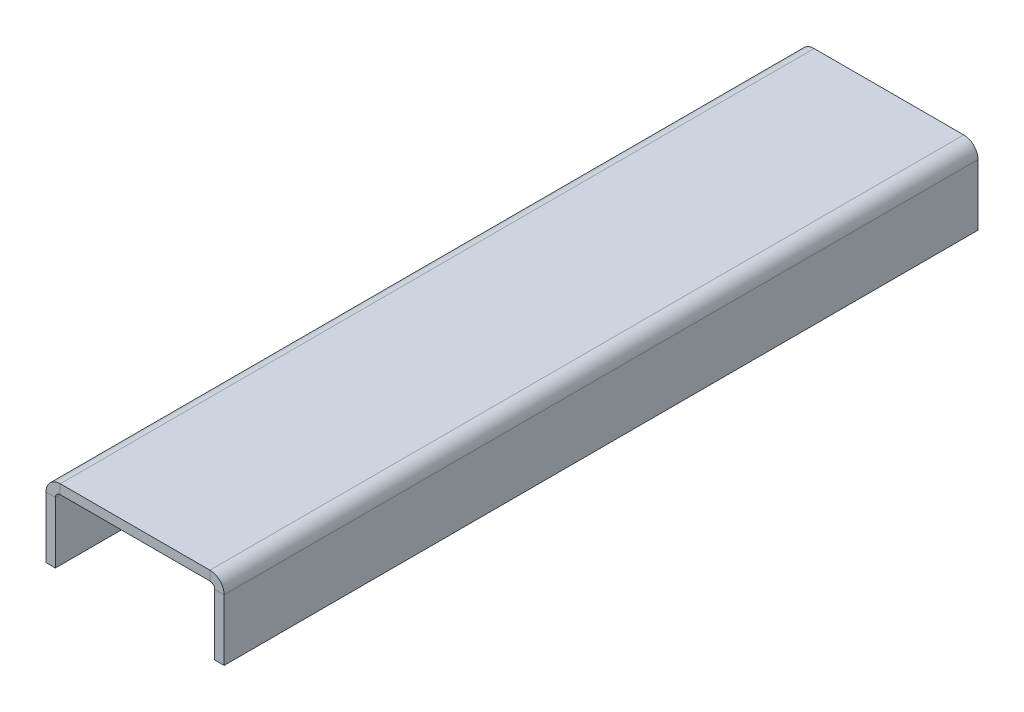
ISO-10303-21;
HEADER;
FILE_DESCRIPTION(('STEP AP214'),'2;1');
FILE_NAME('part.step','',(''),(''),'','','');
FILE_SCHEMA(('AUTOMOTIVE_DESIGN { 1 0 10303 214 1 1 1 1 }'));
ENDSEC;
DATA;
#1=APPLICATION_CONTEXT('core data for automotive mechanical design processes');
#2=APPLICATION_PROTOCOL_DEFINITION('international standard','automotive_design',2000,#1);
#3=PRODUCT_CONTEXT('',#1,'mechanical');
#4=PRODUCT('Part','Part','',(#3));
#5=PRODUCT_RELATED_PRODUCT_CATEGORY('part','',(#4));
#6=PRODUCT_DEFINITION_FORMATION('','',#4);
#7=PRODUCT_DEFINITION_CONTEXT('part definition',#1,'design');
#8=PRODUCT_DEFINITION('design','',#6,#7);
#9=PRODUCT_DEFINITION_SHAPE('','',#8);
#10=(LENGTH_UNIT() NAMED_UNIT(*) SI_UNIT(.MILLI.,.METRE.));
#11=(NAMED_UNIT(*) PLANE_ANGLE_UNIT() SI_UNIT($,.RADIAN.));
#12=(NAMED_UNIT(*) SI_UNIT($,.STERADIAN.) SOLID_ANGLE_UNIT());
#13=UNCERTAINTY_MEASURE_WITH_UNIT(LENGTH_MEASURE(1.E-05),#10,'distance_accuracy_value','');
#14=(GEOMETRIC_REPRESENTATION_CONTEXT(3) GLOBAL_UNCERTAINTY_ASSIGNED_CONTEXT((#13)) GLOBAL_UNIT_ASSIGNED_CONTEXT((#10,
#11,#12)) REPRESENTATION_CONTEXT('',''));
#15=CARTESIAN_POINT('',(0.,0.,0.));
#16=DIRECTION('',(0.,0.,1.));
#17=DIRECTION('',(1.,0.,0.));
#18=AXIS2_PLACEMENT_3D('',#15,#16,#17);
#19=CARTESIAN_POINT('',(-12.60602,0.,127.));
#20=DIRECTION('',(0.,0.,1.));
#21=DIRECTION('',(1.,0.,0.));
#22=AXIS2_PLACEMENT_3D('',#19,#20,#21);
#23=PLANE('',#22);
#24=DIRECTION('',(0.,-1.,0.));
#25=VECTOR('',#24,1.);
#26=CARTESIAN_POINT('',(-12.60602,0.,127.));
#27=LINE('',#26,#25);
#28=CARTESIAN_POINT('',(-12.60602,0.,127.));
#29=VERTEX_POINT('',#28);
#30=CARTESIAN_POINT('',(-12.60602,-1.5875,127.));
#31=VERTEX_POINT('',#30);
#32=EDGE_CURVE('E11',#29,#31,#27,.T.);
#33=ORIENTED_EDGE('',*,*,#32,.F.);
#34=CARTESIAN_POINT('',(-12.60602,-2.4003,127.));
#35=DIRECTION('',(0.,0.,1.));
#36=DIRECTION('',(1.,0.,0.));
#37=AXIS2_PLACEMENT_3D('',#34,#35,#36);
#38=CIRCLE('',#37,2.4003);
#39=CARTESIAN_POINT('',(-15.00632,-2.4003,127.));
#40=VERTEX_POINT('',#39);
#41=EDGE_CURVE('E255',#40,#29,#38,.F.);
#42=ORIENTED_EDGE('',*,*,#41,.F.);
#43=DIRECTION('',(-1.,0.,0.));
#44=VECTOR('',#43,1.);
#45=CARTESIAN_POINT('',(-13.41882,-2.4003,127.));
#46=LINE('',#45,#44);
#47=CARTESIAN_POINT('',(-13.41882,-2.4003,127.));
#48=VERTEX_POINT('',#47);
#49=EDGE_CURVE('E53',#48,#40,#46,.T.);
#50=ORIENTED_EDGE('',*,*,#49,.F.);
#51=CARTESIAN_POINT('',(-12.60602,-2.4003,127.));
#52=DIRECTION('',(0.,0.,1.));
#53=DIRECTION('',(1.,0.,0.));
#54=AXIS2_PLACEMENT_3D('',#51,#52,#53);
#55=CIRCLE('',#54,0.8128);
#56=EDGE_CURVE('E154',#48,#31,#55,.F.);
#57=ORIENTED_EDGE('',*,*,#56,.T.);
#58=EDGE_LOOP('',(#33,#42,#50,#57));
#59=FACE_BOUND('',#58,.T.);
#60=ADVANCED_FACE('F45',(#59),#23,.T.);
#61=CARTESIAN_POINT('',(-13.41882,-2.4003,127.));
#62=DIRECTION('',(0.,0.,1.));
#63=DIRECTION('',(1.,0.,0.));
#64=AXIS2_PLACEMENT_3D('',#61,#62,#63);
#65=PLANE('',#64);
#66=DIRECTION('',(1.,0.,0.));
#67=VECTOR('',#66,1.);
#68=CARTESIAN_POINT('',(-15.00632,0.,127.));
#69=LINE('',#68,#67);
#70=CARTESIAN_POINT('',(12.60602,0.,127.));
#71=VERTEX_POINT('',#70);
#72=EDGE_CURVE('E148',#29,#71,#69,.T.);
#73=ORIENTED_EDGE('',*,*,#72,.F.);
#74=ORIENTED_EDGE('',*,*,#32,.T.);
#75=DIRECTION('',(1.,0.,0.));
#76=VECTOR('',#75,1.);
#77=CARTESIAN_POINT('',(-15.00632,-1.5875,127.));
#78=LINE('',#77,#76);
#79=CARTESIAN_POINT('',(12.60602,-1.5875,127.));
#80=VERTEX_POINT('',#79);
#81=EDGE_CURVE('E145',#31,#80,#78,.T.);
#82=ORIENTED_EDGE('',*,*,#81,.T.);
#83=DIRECTION('',(0.,1.,0.));
#84=VECTOR('',#83,1.);
#85=CARTESIAN_POINT('',(12.60602,-1.5875,127.));
#86=LINE('',#85,#84);
#87=EDGE_CURVE('E236',#80,#71,#86,.T.);
#88=ORIENTED_EDGE('',*,*,#87,.T.);
#89=EDGE_LOOP('',(#73,#74,#82,#88));
#90=FACE_BOUND('',#89,.T.);
#91=ADVANCED_FACE('F143',(#90),#65,.T.);
#92=CARTESIAN_POINT('',(-15.00632,-2.4003,0.));
#93=DIRECTION('',(0.,0.,-1.));
#94=DIRECTION('',(-1.,0.,0.));
#95=AXIS2_PLACEMENT_3D('',#92,#93,#94);
#96=PLANE('',#95);
#97=DIRECTION('',(1.,0.,0.));
#98=VECTOR('',#97,1.);
#99=CARTESIAN_POINT('',(-15.00632,-2.4003,0.));
#100=LINE('',#99,#98);
#101=CARTESIAN_POINT('',(-15.00632,-2.4003,0.));
#102=VERTEX_POINT('',#101);
#103=CARTESIAN_POINT('',(-13.41882,-2.4003,0.));
#104=VERTEX_POINT('',#103);
#105=EDGE_CURVE('E241',#102,#104,#100,.T.);
#106=ORIENTED_EDGE('',*,*,#105,.F.);
#107=CARTESIAN_POINT('',(-12.60602,-2.4003,0.));
#108=DIRECTION('',(0.,0.,1.));
#109=DIRECTION('',(1.,0.,0.));
#110=AXIS2_PLACEMENT_3D('',#107,#108,#109);
#111=CIRCLE('',#110,2.4003);
#112=CARTESIAN_POINT('',(-12.60602,0.,0.));
#113=VERTEX_POINT('',#112);
#114=EDGE_CURVE('E193',#102,#113,#111,.F.);
#115=ORIENTED_EDGE('',*,*,#114,.T.);
#116=DIRECTION('',(0.,1.,0.));
#117=VECTOR('',#116,1.);
#118=CARTESIAN_POINT('',(-12.60602,-1.5875,0.));
#119=LINE('',#118,#117);
#120=CARTESIAN_POINT('',(-12.60602,-1.5875,0.));
#121=VERTEX_POINT('',#120);
#122=EDGE_CURVE('E239',#121,#113,#119,.T.);
#123=ORIENTED_EDGE('',*,*,#122,.F.);
#124=CARTESIAN_POINT('',(-12.60602,-2.4003,0.));
#125=DIRECTION('',(0.,0.,1.));
#126=DIRECTION('',(1.,0.,0.));
#127=AXIS2_PLACEMENT_3D('',#124,#125,#126);
#128=CIRCLE('',#127,0.8128);
#129=EDGE_CURVE('E166',#104,#121,#128,.F.);
#130=ORIENTED_EDGE('',*,*,#129,.F.);
#131=EDGE_LOOP('',(#106,#115,#123,#130));
#132=FACE_BOUND('',#131,.T.);
#133=ADVANCED_FACE('F293',(#132),#96,.T.);
#134=CARTESIAN_POINT('',(-12.60602,-1.5875,0.));
#135=DIRECTION('',(0.,0.,-1.));
#136=DIRECTION('',(-1.,0.,0.));
#137=AXIS2_PLACEMENT_3D('',#134,#135,#136);
#138=PLANE('',#137);
#139=DIRECTION('',(0.,1.,0.));
#140=VECTOR('',#139,1.);
#141=CARTESIAN_POINT('',(-15.00632,-12.7,0.));
#142=LINE('',#141,#140);
#143=CARTESIAN_POINT('',(-15.00632,-12.7,0.));
#144=VERTEX_POINT('',#143);
#145=EDGE_CURVE('E196',#144,#102,#142,.T.);
#146=ORIENTED_EDGE('',*,*,#145,.T.);
#147=ORIENTED_EDGE('',*,*,#105,.T.);
#148=DIRECTION('',(0.,1.,0.));
#149=VECTOR('',#148,1.);
#150=CARTESIAN_POINT('',(-13.41882,-12.7,0.));
#151=LINE('',#150,#149);
#152=CARTESIAN_POINT('',(-13.41882,-12.7,0.));
#153=VERTEX_POINT('',#152);
#154=EDGE_CURVE('E202',#153,#104,#151,.T.);
#155=ORIENTED_EDGE('',*,*,#154,.F.);
#156=DIRECTION('',(-1.,0.,0.));
#157=VECTOR('',#156,1.);
#158=CARTESIAN_POINT('',(-13.41882,-12.7,0.));
#159=LINE('',#158,#157);
#160=EDGE_CURVE('E199',#153,#144,#159,.T.);
#161=ORIENTED_EDGE('',*,*,#160,.T.);
#162=EDGE_LOOP('',(#146,#147,#155,#161));
#163=FACE_BOUND('',#162,.T.);
#164=ADVANCED_FACE('F296',(#163),#138,.T.);
#165=CARTESIAN_POINT('',(15.00632,-2.4003,127.));
#166=DIRECTION('',(0.,0.,1.));
#167=DIRECTION('',(1.,0.,0.));
#168=AXIS2_PLACEMENT_3D('',#165,#166,#167);
#169=PLANE('',#168);
#170=DIRECTION('',(-1.,0.,0.));
#171=VECTOR('',#170,1.);
#172=CARTESIAN_POINT('',(15.00632,-2.4003,127.));
#173=LINE('',#172,#171);
#174=CARTESIAN_POINT('',(15.00632,-2.4003,127.));
#175=VERTEX_POINT('',#174);
#176=CARTESIAN_POINT('',(13.41882,-2.4003,127.));
#177=VERTEX_POINT('',#176);
#178=EDGE_CURVE('E61',#175,#177,#173,.T.);
#179=ORIENTED_EDGE('',*,*,#178,.F.);
#180=CARTESIAN_POINT('',(12.60602,-2.4003,127.));
#181=DIRECTION('',(0.,0.,1.));
#182=DIRECTION('',(1.,0.,0.));
#183=AXIS2_PLACEMENT_3D('',#180,#181,#182);
#184=CIRCLE('',#183,2.4003);
#185=EDGE_CURVE('E265',#71,#175,#184,.F.);
#186=ORIENTED_EDGE('',*,*,#185,.F.);
#187=ORIENTED_EDGE('',*,*,#87,.F.);
#188=CARTESIAN_POINT('',(12.60602,-2.4003,127.));
#189=DIRECTION('',(0.,0.,1.));
#190=DIRECTION('',(1.,0.,0.));
#191=AXIS2_PLACEMENT_3D('',#188,#189,#190);
#192=CIRCLE('',#191,0.8128);
#193=EDGE_CURVE('E174',#80,#177,#192,.F.);
#194=ORIENTED_EDGE('',*,*,#193,.T.);
#195=EDGE_LOOP('',(#179,#186,#187,#194));
#196=FACE_BOUND('',#195,.T.);
#197=ADVANCED_FACE('F288',(#196),#169,.T.);
#198=CARTESIAN_POINT('',(12.60602,-1.5875,127.));
#199=DIRECTION('',(0.,0.,1.));
#200=DIRECTION('',(1.,0.,0.));
#201=AXIS2_PLACEMENT_3D('',#198,#199,#200);
#202=PLANE('',#201);
#203=DIRECTION('',(0.,-1.,0.));
#204=VECTOR('',#203,1.);
#205=CARTESIAN_POINT('',(15.00632,0.,127.));
#206=LINE('',#205,#204);
#207=CARTESIAN_POINT('',(15.00632,-12.7,127.));
#208=VERTEX_POINT('',#207);
#209=EDGE_CURVE('E268',#175,#208,#206,.T.);
#210=ORIENTED_EDGE('',*,*,#209,.F.);
#211=ORIENTED_EDGE('',*,*,#178,.T.);
#212=DIRECTION('',(0.,1.,0.));
#213=VECTOR('',#212,1.);
#214=CARTESIAN_POINT('',(13.41882,0.,127.));
#215=LINE('',#214,#213);
#216=CARTESIAN_POINT('',(13.41882,-12.7,127.));
#217=VERTEX_POINT('',#216);
#218=EDGE_CURVE('E115',#177,#217,#215,.F.);
#219=ORIENTED_EDGE('',*,*,#218,.T.);
#220=DIRECTION('',(-1.,0.,0.));
#221=VECTOR('',#220,1.);
#222=CARTESIAN_POINT('',(15.00632,-12.7,127.));
#223=LINE('',#222,#221);
#224=EDGE_CURVE('E271',#208,#217,#223,.T.);
#225=ORIENTED_EDGE('',*,*,#224,.F.);
#226=EDGE_LOOP('',(#210,#211,#219,#225));
#227=FACE_BOUND('',#226,.T.);
#228=ADVANCED_FACE('F277',(#227),#202,.T.);
#229=CARTESIAN_POINT('',(12.60602,0.,0.));
#230=DIRECTION('',(0.,0.,-1.));
#231=DIRECTION('',(-1.,0.,0.));
#232=AXIS2_PLACEMENT_3D('',#229,#230,#231);
#233=PLANE('',#232);
#234=DIRECTION('',(0.,-1.,0.));
#235=VECTOR('',#234,1.);
#236=CARTESIAN_POINT('',(12.60602,0.,0.));
#237=LINE('',#236,#235);
#238=CARTESIAN_POINT('',(12.60602,0.,0.));
#239=VERTEX_POINT('',#238);
#240=CARTESIAN_POINT('',(12.60602,-1.5875,0.));
#241=VERTEX_POINT('',#240);
#242=EDGE_CURVE('E102',#239,#241,#237,.T.);
#243=ORIENTED_EDGE('',*,*,#242,.F.);
#244=CARTESIAN_POINT('',(12.60602,-2.4003,0.));
#245=DIRECTION('',(0.,0.,1.));
#246=DIRECTION('',(1.,0.,0.));
#247=AXIS2_PLACEMENT_3D('',#244,#245,#246);
#248=CIRCLE('',#247,2.4003);
#249=CARTESIAN_POINT('',(15.00632,-2.4003,0.));
#250=VERTEX_POINT('',#249);
#251=EDGE_CURVE('E189',#239,#250,#248,.F.);
#252=ORIENTED_EDGE('',*,*,#251,.T.);
#253=DIRECTION('',(1.,0.,0.));
#254=VECTOR('',#253,1.);
#255=CARTESIAN_POINT('',(13.41882,-2.4003,0.));
#256=LINE('',#255,#254);
#257=CARTESIAN_POINT('',(13.41882,-2.4003,0.));
#258=VERTEX_POINT('',#257);
#259=EDGE_CURVE('E109',#258,#250,#256,.T.);
#260=ORIENTED_EDGE('',*,*,#259,.F.);
#261=CARTESIAN_POINT('',(12.60602,-2.4003,0.));
#262=DIRECTION('',(0.,0.,1.));
#263=DIRECTION('',(1.,0.,0.));
#264=AXIS2_PLACEMENT_3D('',#261,#262,#263);
#265=CIRCLE('',#264,0.8128);
#266=EDGE_CURVE('E208',#241,#258,#265,.F.);
#267=ORIENTED_EDGE('',*,*,#266,.F.);
#268=EDGE_LOOP('',(#243,#252,#260,#267));
#269=FACE_BOUND('',#268,.T.);
#270=ADVANCED_FACE('F325',(#269),#233,.T.);
#271=CARTESIAN_POINT('',(13.41882,-2.4003,0.));
#272=DIRECTION('',(0.,0.,-1.));
#273=DIRECTION('',(-1.,0.,0.));
#274=AXIS2_PLACEMENT_3D('',#271,#272,#273);
#275=PLANE('',#274);
#276=DIRECTION('',(1.,0.,0.));
#277=VECTOR('',#276,1.);
#278=CARTESIAN_POINT('',(-15.00632,0.,0.));
#279=LINE('',#278,#277);
#280=EDGE_CURVE('E191',#113,#239,#279,.T.);
#281=ORIENTED_EDGE('',*,*,#280,.T.);
#282=ORIENTED_EDGE('',*,*,#242,.T.);
#283=DIRECTION('',(1.,0.,0.));
#284=VECTOR('',#283,1.);
#285=CARTESIAN_POINT('',(-15.00632,-1.5875,0.));
#286=LINE('',#285,#284);
#287=EDGE_CURVE('E206',#121,#241,#286,.T.);
#288=ORIENTED_EDGE('',*,*,#287,.F.);
#289=ORIENTED_EDGE('',*,*,#122,.T.);
#290=EDGE_LOOP('',(#281,#282,#288,#289));
#291=FACE_BOUND('',#290,.T.);
#292=ADVANCED_FACE('F328',(#291),#275,.T.);
#293=CARTESIAN_POINT('',(13.41882,0.,127.));
#294=DIRECTION('',(1.,0.,0.));
#295=DIRECTION('',(0.,0.,-1.));
#296=AXIS2_PLACEMENT_3D('',#293,#294,#295);
#297=PLANE('',#296);
#298=DIRECTION('',(0.,1.,0.));
#299=VECTOR('',#298,1.);
#300=CARTESIAN_POINT('',(13.41882,0.,0.));
#301=LINE('',#300,#299);
#302=CARTESIAN_POINT('',(13.41882,-12.7,0.));
#303=VERTEX_POINT('',#302);
#304=EDGE_CURVE('E180',#258,#303,#301,.F.);
#305=ORIENTED_EDGE('',*,*,#304,.T.);
#306=DIRECTION('',(0.,0.,-1.));
#307=VECTOR('',#306,1.);
#308=CARTESIAN_POINT('',(13.41882,-12.7,127.));
#309=LINE('',#308,#307);
#310=EDGE_CURVE('E232',#217,#303,#309,.T.);
#311=ORIENTED_EDGE('',*,*,#310,.F.);
#312=ORIENTED_EDGE('',*,*,#218,.F.);
#313=DIRECTION('',(0.,0.,-1.));
#314=VECTOR('',#313,1.);
#315=CARTESIAN_POINT('',(13.41882,-2.4003,127.));
#316=LINE('',#315,#314);
#317=EDGE_CURVE('E176',#177,#258,#316,.T.);
#318=ORIENTED_EDGE('',*,*,#317,.T.);
#319=EDGE_LOOP('',(#305,#311,#312,#318));
#320=FACE_BOUND('',#319,.T.);
#321=ADVANCED_FACE('F331',(#320),#297,.F.);
#322=CARTESIAN_POINT('',(15.00632,-12.7,127.));
#323=DIRECTION('',(0.,-1.,0.));
#324=DIRECTION('',(0.,0.,-1.));
#325=AXIS2_PLACEMENT_3D('',#322,#323,#324);
#326=PLANE('',#325);
#327=DIRECTION('',(-1.,0.,0.));
#328=VECTOR('',#327,1.);
#329=CARTESIAN_POINT('',(15.00632,-12.7,0.));
#330=LINE('',#329,#328);
#331=CARTESIAN_POINT('',(15.00632,-12.7,0.));
#332=VERTEX_POINT('',#331);
#333=EDGE_CURVE('E183',#332,#303,#330,.T.);
#334=ORIENTED_EDGE('',*,*,#333,.F.);
#335=DIRECTION('',(0.,0.,-1.));
#336=VECTOR('',#335,1.);
#337=CARTESIAN_POINT('',(15.00632,-12.7,127.));
#338=LINE('',#337,#336);
#339=EDGE_CURVE('E230',#208,#332,#338,.T.);
#340=ORIENTED_EDGE('',*,*,#339,.F.);
#341=ORIENTED_EDGE('',*,*,#224,.T.);
#342=ORIENTED_EDGE('',*,*,#310,.T.);
#343=EDGE_LOOP('',(#334,#340,#341,#342));
#344=FACE_BOUND('',#343,.T.);
#345=ADVANCED_FACE('F276',(#344),#326,.T.);
#346=CARTESIAN_POINT('',(15.00632,0.,127.));
#347=DIRECTION('',(1.,0.,0.));
#348=DIRECTION('',(0.,0.,-1.));
#349=AXIS2_PLACEMENT_3D('',#346,#347,#348);
#350=PLANE('',#349);
#351=DIRECTION('',(0.,-1.,0.));
#352=VECTOR('',#351,1.);
#353=CARTESIAN_POINT('',(15.00632,0.,0.));
#354=LINE('',#353,#352);
#355=EDGE_CURVE('E186',#250,#332,#354,.T.);
#356=ORIENTED_EDGE('',*,*,#355,.F.);
#357=DIRECTION('',(0.,0.,-1.));
#358=VECTOR('',#357,1.);
#359=CARTESIAN_POINT('',(15.00632,-2.4003,127.));
#360=LINE('',#359,#358);
#361=EDGE_CURVE('E227',#175,#250,#360,.T.);
#362=ORIENTED_EDGE('',*,*,#361,.F.);
#363=ORIENTED_EDGE('',*,*,#209,.T.);
#364=ORIENTED_EDGE('',*,*,#339,.T.);
#365=EDGE_LOOP('',(#356,#362,#363,#364));
#366=FACE_BOUND('',#365,.T.);
#367=ADVANCED_FACE('F281',(#366),#350,.T.);
#368=CARTESIAN_POINT('',(12.60602,-2.4003,127.));
#369=DIRECTION('',(0.,0.,-1.));
#370=DIRECTION('',(-1.,0.,0.));
#371=AXIS2_PLACEMENT_3D('',#368,#369,#370);
#372=CYLINDRICAL_SURFACE('',#371,2.4003);
#373=ORIENTED_EDGE('',*,*,#251,.F.);
#374=DIRECTION('',(0.,0.,-1.));
#375=VECTOR('',#374,1.);
#376=CARTESIAN_POINT('',(12.60602,0.,127.));
#377=LINE('',#376,#375);
#378=EDGE_CURVE('E224',#71,#239,#377,.T.);
#379=ORIENTED_EDGE('',*,*,#378,.F.);
#380=ORIENTED_EDGE('',*,*,#185,.T.);
#381=ORIENTED_EDGE('',*,*,#361,.T.);
#382=EDGE_LOOP('',(#373,#379,#380,#381));
#383=FACE_BOUND('',#382,.T.);
#384=ADVANCED_FACE('F284',(#383),#372,.T.);
#385=CARTESIAN_POINT('',(-15.00632,0.,127.));
#386=DIRECTION('',(0.,1.,0.));
#387=DIRECTION('',(0.,0.,1.));
#388=AXIS2_PLACEMENT_3D('',#385,#386,#387);
#389=PLANE('',#388);
#390=ORIENTED_EDGE('',*,*,#280,.F.);
#391=DIRECTION('',(0.,0.,-1.));
#392=VECTOR('',#391,1.);
#393=CARTESIAN_POINT('',(-12.60602,0.,127.));
#394=LINE('',#393,#392);
#395=EDGE_CURVE('E221',#29,#113,#394,.T.);
#396=ORIENTED_EDGE('',*,*,#395,.F.);
#397=ORIENTED_EDGE('',*,*,#72,.T.);
#398=ORIENTED_EDGE('',*,*,#378,.T.);
#399=EDGE_LOOP('',(#390,#396,#397,#398));
#400=FACE_BOUND('',#399,.T.);
#401=ADVANCED_FACE('F291',(#400),#389,.T.);
#402=CARTESIAN_POINT('',(-12.60602,-2.4003,127.));
#403=DIRECTION('',(0.,0.,-1.));
#404=DIRECTION('',(-1.,0.,0.));
#405=AXIS2_PLACEMENT_3D('',#402,#403,#404);
#406=CYLINDRICAL_SURFACE('',#405,2.4003);
#407=ORIENTED_EDGE('',*,*,#114,.F.);
#408=DIRECTION('',(0.,0.,-1.));
#409=VECTOR('',#408,1.);
#410=CARTESIAN_POINT('',(-15.00632,-2.4003,127.));
#411=LINE('',#410,#409);
#412=EDGE_CURVE('E218',#40,#102,#411,.T.);
#413=ORIENTED_EDGE('',*,*,#412,.F.);
#414=ORIENTED_EDGE('',*,*,#41,.T.);
#415=ORIENTED_EDGE('',*,*,#395,.T.);
#416=EDGE_LOOP('',(#407,#413,#414,#415));
#417=FACE_BOUND('',#416,.T.);
#418=ADVANCED_FACE('F254',(#417),#406,.T.);
#419=CARTESIAN_POINT('',(-15.00632,-12.7,127.));
#420=DIRECTION('',(-1.,0.,0.));
#421=DIRECTION('',(0.,0.,1.));
#422=AXIS2_PLACEMENT_3D('',#419,#420,#421);
#423=PLANE('',#422);
#424=ORIENTED_EDGE('',*,*,#145,.F.);
#425=DIRECTION('',(0.,0.,-1.));
#426=VECTOR('',#425,1.);
#427=CARTESIAN_POINT('',(-15.00632,-12.7,127.));
#428=LINE('',#427,#426);
#429=CARTESIAN_POINT('',(-15.00632,-12.7,127.));
#430=VERTEX_POINT('',#429);
#431=EDGE_CURVE('E216',#430,#144,#428,.T.);
#432=ORIENTED_EDGE('',*,*,#431,.F.);
#433=DIRECTION('',(0.,1.,0.));
#434=VECTOR('',#433,1.);
#435=CARTESIAN_POINT('',(-15.00632,-12.7,127.));
#436=LINE('',#435,#434);
#437=EDGE_CURVE('E248',#430,#40,#436,.T.);
#438=ORIENTED_EDGE('',*,*,#437,.T.);
#439=ORIENTED_EDGE('',*,*,#412,.T.);
#440=EDGE_LOOP('',(#424,#432,#438,#439));
#441=FACE_BOUND('',#440,.T.);
#442=ADVANCED_FACE('F259',(#441),#423,.T.);
#443=CARTESIAN_POINT('',(-13.41882,-12.7,127.));
#444=DIRECTION('',(0.,-1.,0.));
#445=DIRECTION('',(0.,0.,-1.));
#446=AXIS2_PLACEMENT_3D('',#443,#444,#445);
#447=PLANE('',#446);
#448=ORIENTED_EDGE('',*,*,#160,.F.);
#449=DIRECTION('',(0.,0.,-1.));
#450=VECTOR('',#449,1.);
#451=CARTESIAN_POINT('',(-13.41882,-12.7,127.));
#452=LINE('',#451,#450);
#453=CARTESIAN_POINT('',(-13.41882,-12.7,127.));
#454=VERTEX_POINT('',#453);
#455=EDGE_CURVE('E214',#454,#153,#452,.T.);
#456=ORIENTED_EDGE('',*,*,#455,.F.);
#457=DIRECTION('',(-1.,0.,0.));
#458=VECTOR('',#457,1.);
#459=CARTESIAN_POINT('',(-13.41882,-12.7,127.));
#460=LINE('',#459,#458);
#461=EDGE_CURVE('E260',#454,#430,#460,.T.);
#462=ORIENTED_EDGE('',*,*,#461,.T.);
#463=ORIENTED_EDGE('',*,*,#431,.T.);
#464=EDGE_LOOP('',(#448,#456,#462,#463));
#465=FACE_BOUND('',#464,.T.);
#466=ADVANCED_FACE('F301',(#465),#447,.T.);
#467=CARTESIAN_POINT('',(-13.41882,-12.7,127.));
#468=DIRECTION('',(-1.,0.,0.));
#469=DIRECTION('',(0.,0.,1.));
#470=AXIS2_PLACEMENT_3D('',#467,#468,#469);
#471=PLANE('',#470);
#472=ORIENTED_EDGE('',*,*,#154,.T.);
#473=DIRECTION('',(0.,0.,-1.));
#474=VECTOR('',#473,1.);
#475=CARTESIAN_POINT('',(-13.41882,-2.4003,127.));
#476=LINE('',#475,#474);
#477=EDGE_CURVE('E168',#48,#104,#476,.T.);
#478=ORIENTED_EDGE('',*,*,#477,.F.);
#479=DIRECTION('',(0.,1.,0.));
#480=VECTOR('',#479,1.);
#481=CARTESIAN_POINT('',(-13.41882,-12.7,127.));
#482=LINE('',#481,#480);
#483=EDGE_CURVE('E159',#454,#48,#482,.T.);
#484=ORIENTED_EDGE('',*,*,#483,.F.);
#485=ORIENTED_EDGE('',*,*,#455,.T.);
#486=EDGE_LOOP('',(#472,#478,#484,#485));
#487=FACE_BOUND('',#486,.T.);
#488=ADVANCED_FACE('F299',(#487),#471,.F.);
#489=CARTESIAN_POINT('',(-12.60602,-2.4003,127.));
#490=DIRECTION('',(0.,0.,-1.));
#491=DIRECTION('',(-1.,0.,0.));
#492=AXIS2_PLACEMENT_3D('',#489,#490,#491);
#493=CYLINDRICAL_SURFACE('',#492,0.8128);
#494=ORIENTED_EDGE('',*,*,#129,.T.);
#495=DIRECTION('',(0.,0.,-1.));
#496=VECTOR('',#495,1.);
#497=CARTESIAN_POINT('',(-12.60602,-1.5875,127.));
#498=LINE('',#497,#496);
#499=EDGE_CURVE('E163',#31,#121,#498,.T.);
#500=ORIENTED_EDGE('',*,*,#499,.F.);
#501=ORIENTED_EDGE('',*,*,#56,.F.);
#502=ORIENTED_EDGE('',*,*,#477,.T.);
#503=EDGE_LOOP('',(#494,#500,#501,#502));
#504=FACE_BOUND('',#503,.T.);
#505=ADVANCED_FACE('F164',(#504),#493,.F.);
#506=CARTESIAN_POINT('',(-15.00632,-1.5875,127.));
#507=DIRECTION('',(0.,1.,0.));
#508=DIRECTION('',(0.,0.,1.));
#509=AXIS2_PLACEMENT_3D('',#506,#507,#508);
#510=PLANE('',#509);
#511=ORIENTED_EDGE('',*,*,#287,.T.);
#512=DIRECTION('',(0.,0.,-1.));
#513=VECTOR('',#512,1.);
#514=CARTESIAN_POINT('',(12.60602,-1.5875,127.));
#515=LINE('',#514,#513);
#516=EDGE_CURVE('E169',#80,#241,#515,.T.);
#517=ORIENTED_EDGE('',*,*,#516,.F.);
#518=ORIENTED_EDGE('',*,*,#81,.F.);
#519=ORIENTED_EDGE('',*,*,#499,.T.);
#520=EDGE_LOOP('',(#511,#517,#518,#519));
#521=FACE_BOUND('',#520,.T.);
#522=ADVANCED_FACE('F171',(#521),#510,.F.);
#523=CARTESIAN_POINT('',(12.60602,-2.4003,127.));
#524=DIRECTION('',(0.,0.,-1.));
#525=DIRECTION('',(-1.,0.,0.));
#526=AXIS2_PLACEMENT_3D('',#523,#524,#525);
#527=CYLINDRICAL_SURFACE('',#526,0.8128);
#528=ORIENTED_EDGE('',*,*,#266,.T.);
#529=ORIENTED_EDGE('',*,*,#317,.F.);
#530=ORIENTED_EDGE('',*,*,#193,.F.);
#531=ORIENTED_EDGE('',*,*,#516,.T.);
#532=EDGE_LOOP('',(#528,#529,#530,#531));
#533=FACE_BOUND('',#532,.T.);
#534=ADVANCED_FACE('F385',(#533),#527,.F.);
#535=CARTESIAN_POINT('',(12.60602,-2.4003,127.));
#536=DIRECTION('',(0.,0.,1.));
#537=DIRECTION('',(1.,0.,0.));
#538=AXIS2_PLACEMENT_3D('',#535,#536,#537);
#539=PLANE('',#538);
#540=ORIENTED_EDGE('',*,*,#483,.T.);
#541=ORIENTED_EDGE('',*,*,#49,.T.);
#542=ORIENTED_EDGE('',*,*,#437,.F.);
#543=ORIENTED_EDGE('',*,*,#461,.F.);
#544=EDGE_LOOP('',(#540,#541,#542,#543));
#545=FACE_BOUND('',#544,.T.);
#546=ADVANCED_FACE('F245',(#545),#539,.T.);
#547=CARTESIAN_POINT('',(12.60602,-2.4003,0.));
#548=DIRECTION('',(0.,0.,1.));
#549=DIRECTION('',(1.,0.,0.));
#550=AXIS2_PLACEMENT_3D('',#547,#548,#549);
#551=PLANE('',#550);
#552=ORIENTED_EDGE('',*,*,#304,.F.);
#553=ORIENTED_EDGE('',*,*,#259,.T.);
#554=ORIENTED_EDGE('',*,*,#355,.T.);
#555=ORIENTED_EDGE('',*,*,#333,.T.);
#556=EDGE_LOOP('',(#552,#553,#554,#555));
#557=FACE_BOUND('',#556,.T.);
#558=ADVANCED_FACE('F405',(#557),#551,.F.);
#559=CLOSED_SHELL('',(#60,#91,#133,#164,#197,#228,#270,#292,#321,#345,#367,#384,#401,#418,#442,
#466,#488,#505,#522,#534,#546,#558));
#560=MANIFOLD_SOLID_BREP('B2',#559);
#561=ADVANCED_BREP_SHAPE_REPRESENTATION('',(#18,#560),#14);
#562=SHAPE_DEFINITION_REPRESENTATION(#9,#561);
ENDSEC;
END-ISO-10303-21;
